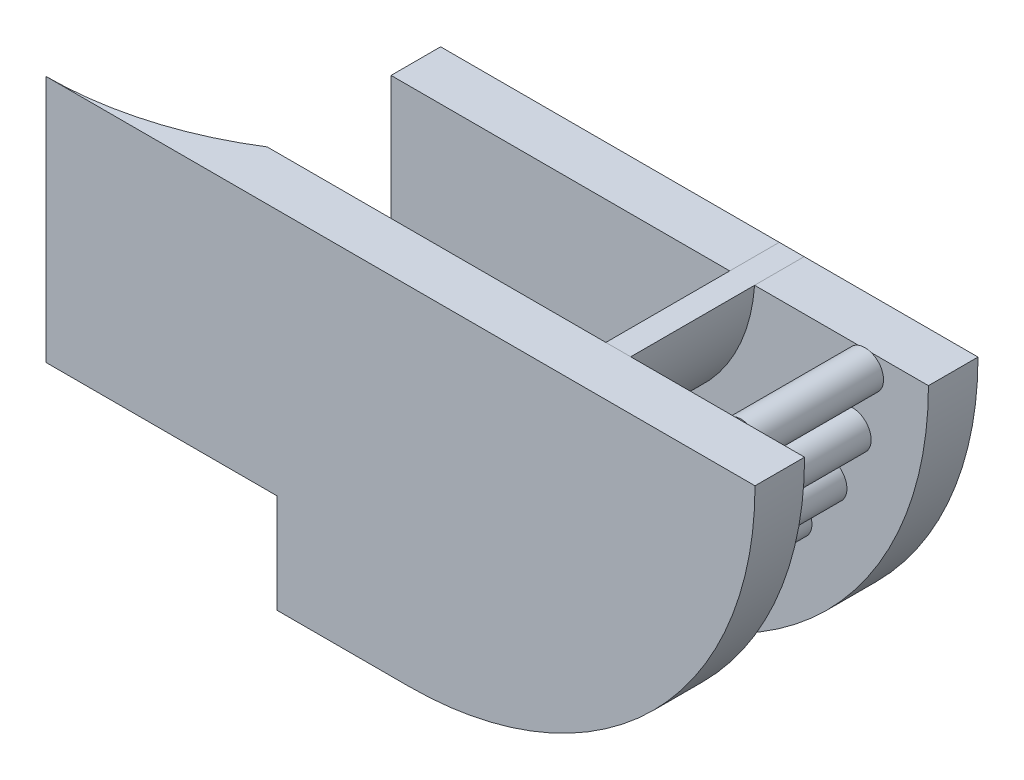
ISO-10303-21;
HEADER;
FILE_DESCRIPTION(('STEP AP214'),'2;1');
FILE_NAME('part.step','',(''),(''),'','','');
FILE_SCHEMA(('AUTOMOTIVE_DESIGN { 1 0 10303 214 1 1 1 1 }'));
ENDSEC;
DATA;
#1=APPLICATION_CONTEXT('core data for automotive mechanical design processes');
#2=APPLICATION_PROTOCOL_DEFINITION('international standard','automotive_design',2000,#1);
#3=PRODUCT_CONTEXT('',#1,'mechanical');
#4=PRODUCT('Part','Part','',(#3));
#5=PRODUCT_RELATED_PRODUCT_CATEGORY('part','',(#4));
#6=PRODUCT_DEFINITION_FORMATION('','',#4);
#7=PRODUCT_DEFINITION_CONTEXT('part definition',#1,'design');
#8=PRODUCT_DEFINITION('design','',#6,#7);
#9=PRODUCT_DEFINITION_SHAPE('','',#8);
#10=(LENGTH_UNIT() NAMED_UNIT(*) SI_UNIT(.MILLI.,.METRE.));
#11=(NAMED_UNIT(*) PLANE_ANGLE_UNIT() SI_UNIT($,.RADIAN.));
#12=(NAMED_UNIT(*) SI_UNIT($,.STERADIAN.) SOLID_ANGLE_UNIT());
#13=UNCERTAINTY_MEASURE_WITH_UNIT(LENGTH_MEASURE(1.E-05),#10,'distance_accuracy_value','');
#14=(GEOMETRIC_REPRESENTATION_CONTEXT(3) GLOBAL_UNCERTAINTY_ASSIGNED_CONTEXT((#13)) GLOBAL_UNIT_ASSIGNED_CONTEXT((#10,
#11,#12)) REPRESENTATION_CONTEXT('',''));
#15=CARTESIAN_POINT('',(0.,0.,0.));
#16=DIRECTION('',(0.,0.,1.));
#17=DIRECTION('',(1.,0.,0.));
#18=AXIS2_PLACEMENT_3D('',#15,#16,#17);
#19=CARTESIAN_POINT('',(0.,0.,0.));
#20=DIRECTION('',(0.,0.,1.));
#21=DIRECTION('',(1.,0.,0.));
#22=AXIS2_PLACEMENT_3D('',#19,#20,#21);
#23=PLANE('',#22);
#24=DIRECTION('',(1.,0.,0.));
#25=VECTOR('',#24,1.);
#26=CARTESIAN_POINT('',(0.,70.,0.));
#27=LINE('',#26,#25);
#28=CARTESIAN_POINT('',(44.8956518577535,70.,0.));
#29=VERTEX_POINT('',#28);
#30=CARTESIAN_POINT('',(49.9106001094224,70.,0.));
#31=VERTEX_POINT('',#30);
#32=EDGE_CURVE('E144',#29,#31,#27,.T.);
#33=ORIENTED_EDGE('',*,*,#32,.F.);
#34=CARTESIAN_POINT('',(15.,72.5,0.));
#35=DIRECTION('',(0.,0.,1.));
#36=DIRECTION('',(1.,0.,0.));
#37=AXIS2_PLACEMENT_3D('',#34,#35,#36);
#38=CIRCLE('',#37,30.);
#39=CARTESIAN_POINT('',(15.,42.5,0.));
#40=VERTEX_POINT('',#39);
#41=EDGE_CURVE('E148',#29,#40,#38,.F.);
#42=ORIENTED_EDGE('',*,*,#41,.T.);
#43=DIRECTION('',(1.,0.,0.));
#44=VECTOR('',#43,1.);
#45=CARTESIAN_POINT('',(0.,42.5,0.));
#46=LINE('',#45,#44);
#47=CARTESIAN_POINT('',(0.,42.5,0.));
#48=VERTEX_POINT('',#47);
#49=EDGE_CURVE('E150',#48,#40,#46,.T.);
#50=ORIENTED_EDGE('',*,*,#49,.F.);
#51=DIRECTION('',(0.,1.,0.));
#52=VECTOR('',#51,1.);
#53=CARTESIAN_POINT('',(0.,0.,0.));
#54=LINE('',#53,#52);
#55=CARTESIAN_POINT('',(0.,37.5,0.));
#56=VERTEX_POINT('',#55);
#57=EDGE_CURVE('E133',#56,#48,#54,.T.);
#58=ORIENTED_EDGE('',*,*,#57,.F.);
#59=DIRECTION('',(1.,0.,0.));
#60=VECTOR('',#59,1.);
#61=CARTESIAN_POINT('',(0.,37.5,0.));
#62=LINE('',#61,#60);
#63=CARTESIAN_POINT('',(15.,37.5,0.));
#64=VERTEX_POINT('',#63);
#65=EDGE_CURVE('E100',#56,#64,#62,.T.);
#66=ORIENTED_EDGE('',*,*,#65,.T.);
#67=CARTESIAN_POINT('',(15.,72.5,0.));
#68=DIRECTION('',(0.,0.,1.));
#69=DIRECTION('',(1.,0.,0.));
#70=AXIS2_PLACEMENT_3D('',#67,#68,#69);
#71=CIRCLE('',#70,35.);
#72=EDGE_CURVE('E105',#31,#64,#71,.F.);
#73=ORIENTED_EDGE('',*,*,#72,.F.);
#74=EDGE_LOOP('',(#33,#42,#50,#58,#66,#73));
#75=FACE_BOUND('',#74,.T.);
#76=ADVANCED_FACE('F62',(#75),#23,.T.);
#77=CARTESIAN_POINT('',(0.,0.,-35.));
#78=DIRECTION('',(0.,0.,-1.));
#79=DIRECTION('',(-1.,0.,0.));
#80=AXIS2_PLACEMENT_3D('',#77,#78,#79);
#81=PLANE('',#80);
#82=CARTESIAN_POINT('',(15.,72.5,-35.));
#83=DIRECTION('',(0.,0.,-1.));
#84=DIRECTION('',(-1.,0.,0.));
#85=AXIS2_PLACEMENT_3D('',#82,#83,#84);
#86=CIRCLE('',#85,30.);
#87=CARTESIAN_POINT('',(44.8956518577535,70.,-35.));
#88=VERTEX_POINT('',#87);
#89=CARTESIAN_POINT('',(15.,42.5,-35.));
#90=VERTEX_POINT('',#89);
#91=EDGE_CURVE('E13',#88,#90,#86,.T.);
#92=ORIENTED_EDGE('',*,*,#91,.F.);
#93=DIRECTION('',(1.,0.,0.));
#94=VECTOR('',#93,1.);
#95=CARTESIAN_POINT('',(0.,70.,-35.));
#96=LINE('',#95,#94);
#97=CARTESIAN_POINT('',(49.9106001094224,70.,-35.));
#98=VERTEX_POINT('',#97);
#99=EDGE_CURVE('E137',#88,#98,#96,.T.);
#100=ORIENTED_EDGE('',*,*,#99,.T.);
#101=CARTESIAN_POINT('',(15.,72.5,-35.));
#102=DIRECTION('',(0.,0.,-1.));
#103=DIRECTION('',(-1.,0.,0.));
#104=AXIS2_PLACEMENT_3D('',#101,#102,#103);
#105=CIRCLE('',#104,35.);
#106=CARTESIAN_POINT('',(15.,37.5,-35.));
#107=VERTEX_POINT('',#106);
#108=EDGE_CURVE('E121',#98,#107,#105,.T.);
#109=ORIENTED_EDGE('',*,*,#108,.T.);
#110=DIRECTION('',(1.,0.,0.));
#111=VECTOR('',#110,1.);
#112=CARTESIAN_POINT('',(0.,37.5,-35.));
#113=LINE('',#112,#111);
#114=CARTESIAN_POINT('',(0.,37.5,-35.));
#115=VERTEX_POINT('',#114);
#116=EDGE_CURVE('E127',#115,#107,#113,.T.);
#117=ORIENTED_EDGE('',*,*,#116,.F.);
#118=DIRECTION('',(0.,1.,0.));
#119=VECTOR('',#118,1.);
#120=CARTESIAN_POINT('',(0.,0.,-35.));
#121=LINE('',#120,#119);
#122=CARTESIAN_POINT('',(0.,42.5,-35.));
#123=VERTEX_POINT('',#122);
#124=EDGE_CURVE('E138',#115,#123,#121,.T.);
#125=ORIENTED_EDGE('',*,*,#124,.T.);
#126=DIRECTION('',(1.,0.,0.));
#127=VECTOR('',#126,1.);
#128=CARTESIAN_POINT('',(0.,42.5,-35.));
#129=LINE('',#128,#127);
#130=EDGE_CURVE('E140',#123,#90,#129,.T.);
#131=ORIENTED_EDGE('',*,*,#130,.T.);
#132=EDGE_LOOP('',(#92,#100,#109,#117,#125,#131));
#133=FACE_BOUND('',#132,.T.);
#134=ADVANCED_FACE('F135',(#133),#81,.T.);
#135=CARTESIAN_POINT('',(0.,70.,59.5593653700463));
#136=DIRECTION('',(0.,1.,0.));
#137=DIRECTION('',(-1.,0.,0.));
#138=AXIS2_PLACEMENT_3D('',#135,#136,#137);
#139=PLANE('',#138);
#140=DIRECTION('',(0.,0.,-1.));
#141=VECTOR('',#140,1.);
#142=CARTESIAN_POINT('',(44.8956518577535,70.,59.5593653700463));
#143=LINE('',#142,#141);
#144=EDGE_CURVE('E65',#29,#88,#143,.T.);
#145=ORIENTED_EDGE('',*,*,#144,.F.);
#146=ORIENTED_EDGE('',*,*,#32,.T.);
#147=DIRECTION('',(0.,0.,-1.));
#148=VECTOR('',#147,1.);
#149=CARTESIAN_POINT('',(49.9106001094224,70.,59.5593653700463));
#150=LINE('',#149,#148);
#151=EDGE_CURVE('E147',#31,#98,#150,.T.);
#152=ORIENTED_EDGE('',*,*,#151,.T.);
#153=ORIENTED_EDGE('',*,*,#99,.F.);
#154=EDGE_LOOP('',(#145,#146,#152,#153));
#155=FACE_BOUND('',#154,.T.);
#156=ADVANCED_FACE('F162',(#155),#139,.T.);
#157=CARTESIAN_POINT('',(15.,72.5,59.5593653700463));
#158=DIRECTION('',(0.,0.,-1.));
#159=DIRECTION('',(-1.,0.,0.));
#160=AXIS2_PLACEMENT_3D('',#157,#158,#159);
#161=CYLINDRICAL_SURFACE('',#160,35.);
#162=ORIENTED_EDGE('',*,*,#151,.F.);
#163=ORIENTED_EDGE('',*,*,#72,.T.);
#164=DIRECTION('',(0.,0.,-1.));
#165=VECTOR('',#164,1.);
#166=CARTESIAN_POINT('',(15.,37.5,59.5593653700463));
#167=LINE('',#166,#165);
#168=EDGE_CURVE('E117',#64,#107,#167,.T.);
#169=ORIENTED_EDGE('',*,*,#168,.T.);
#170=ORIENTED_EDGE('',*,*,#108,.F.);
#171=EDGE_LOOP('',(#162,#163,#169,#170));
#172=FACE_BOUND('',#171,.T.);
#173=ADVANCED_FACE('F119',(#172),#161,.T.);
#174=CARTESIAN_POINT('',(0.,37.5,59.5593653700463));
#175=DIRECTION('',(0.,1.,0.));
#176=DIRECTION('',(-1.,0.,0.));
#177=AXIS2_PLACEMENT_3D('',#174,#175,#176);
#178=PLANE('',#177);
#179=ORIENTED_EDGE('',*,*,#65,.F.);
#180=DIRECTION('',(0.,0.,-1.));
#181=VECTOR('',#180,1.);
#182=CARTESIAN_POINT('',(0.,37.5,59.5593653700463));
#183=LINE('',#182,#181);
#184=EDGE_CURVE('E124',#56,#115,#183,.T.);
#185=ORIENTED_EDGE('',*,*,#184,.T.);
#186=ORIENTED_EDGE('',*,*,#116,.T.);
#187=ORIENTED_EDGE('',*,*,#168,.F.);
#188=EDGE_LOOP('',(#179,#185,#186,#187));
#189=FACE_BOUND('',#188,.T.);
#190=ADVANCED_FACE('F128',(#189),#178,.F.);
#191=CARTESIAN_POINT('',(0.,0.,59.5593653700463));
#192=DIRECTION('',(-1.,0.,0.));
#193=DIRECTION('',(0.,-1.,0.));
#194=AXIS2_PLACEMENT_3D('',#191,#192,#193);
#195=PLANE('',#194);
#196=ORIENTED_EDGE('',*,*,#184,.F.);
#197=ORIENTED_EDGE('',*,*,#57,.T.);
#198=DIRECTION('',(0.,0.,-1.));
#199=VECTOR('',#198,1.);
#200=CARTESIAN_POINT('',(0.,42.5,59.5593653700463));
#201=LINE('',#200,#199);
#202=EDGE_CURVE('E154',#48,#123,#201,.T.);
#203=ORIENTED_EDGE('',*,*,#202,.T.);
#204=ORIENTED_EDGE('',*,*,#124,.F.);
#205=EDGE_LOOP('',(#196,#197,#203,#204));
#206=FACE_BOUND('',#205,.T.);
#207=ADVANCED_FACE('F171',(#206),#195,.T.);
#208=CARTESIAN_POINT('',(0.,42.5,59.5593653700463));
#209=DIRECTION('',(0.,1.,0.));
#210=DIRECTION('',(-1.,0.,0.));
#211=AXIS2_PLACEMENT_3D('',#208,#209,#210);
#212=PLANE('',#211);
#213=ORIENTED_EDGE('',*,*,#202,.F.);
#214=ORIENTED_EDGE('',*,*,#49,.T.);
#215=DIRECTION('',(0.,0.,-1.));
#216=VECTOR('',#215,1.);
#217=CARTESIAN_POINT('',(15.,42.5,59.5593653700463));
#218=LINE('',#217,#216);
#219=EDGE_CURVE('E153',#40,#90,#218,.T.);
#220=ORIENTED_EDGE('',*,*,#219,.T.);
#221=ORIENTED_EDGE('',*,*,#130,.F.);
#222=EDGE_LOOP('',(#213,#214,#220,#221));
#223=FACE_BOUND('',#222,.T.);
#224=ADVANCED_FACE('F169',(#223),#212,.T.);
#225=CARTESIAN_POINT('',(15.,72.5,59.5593653700463));
#226=DIRECTION('',(0.,0.,-1.));
#227=DIRECTION('',(-1.,0.,0.));
#228=AXIS2_PLACEMENT_3D('',#225,#226,#227);
#229=CYLINDRICAL_SURFACE('',#228,30.);
#230=ORIENTED_EDGE('',*,*,#41,.F.);
#231=ORIENTED_EDGE('',*,*,#144,.T.);
#232=ORIENTED_EDGE('',*,*,#91,.T.);
#233=ORIENTED_EDGE('',*,*,#219,.F.);
#234=EDGE_LOOP('',(#230,#231,#232,#233));
#235=FACE_BOUND('',#234,.T.);
#236=ADVANCED_FACE('F164',(#235),#229,.F.);
#237=CLOSED_SHELL('',(#76,#134,#156,#173,#190,#207,#224,#236));
#238=MANIFOLD_SOLID_BREP('B2',#237);
#239=CARTESIAN_POINT('',(0.,0.,10.));
#240=DIRECTION('',(0.,1.,0.));
#241=DIRECTION('',(0.,0.,1.));
#242=AXIS2_PLACEMENT_3D('',#239,#240,#241);
#243=PLANE('',#242);
#244=DIRECTION('',(1.,0.,0.));
#245=VECTOR('',#244,1.);
#246=CARTESIAN_POINT('',(0.,0.,0.));
#247=LINE('',#246,#245);
#248=CARTESIAN_POINT('',(0.,0.,0.));
#249=VERTEX_POINT('',#248);
#250=CARTESIAN_POINT('',(15.,0.,0.));
#251=VERTEX_POINT('',#250);
#252=EDGE_CURVE('E455',#249,#251,#247,.T.);
#253=ORIENTED_EDGE('',*,*,#252,.T.);
#254=DIRECTION('',(0.,0.,-1.));
#255=VECTOR('',#254,1.);
#256=CARTESIAN_POINT('',(15.,0.,10.));
#257=LINE('',#256,#255);
#258=CARTESIAN_POINT('',(15.,0.,10.));
#259=VERTEX_POINT('',#258);
#260=EDGE_CURVE('E473',#259,#251,#257,.T.);
#261=ORIENTED_EDGE('',*,*,#260,.F.);
#262=DIRECTION('',(1.,0.,0.));
#263=VECTOR('',#262,1.);
#264=CARTESIAN_POINT('',(0.,0.,10.));
#265=LINE('',#264,#263);
#266=CARTESIAN_POINT('',(-11.4578549276672,0.,9.99999999999999));
#267=VERTEX_POINT('',#266);
#268=EDGE_CURVE('E456',#267,#259,#265,.T.);
#269=ORIENTED_EDGE('',*,*,#268,.F.);
#270=CARTESIAN_POINT('',(-58.0947501931113,0.,-55.));
#271=DIRECTION('',(0.,1.,0.));
#272=DIRECTION('',(0.,0.,1.));
#273=AXIS2_PLACEMENT_3D('',#270,#271,#272);
#274=CIRCLE('',#273,80.);
#275=EDGE_CURVE('E450',#249,#267,#274,.F.);
#276=ORIENTED_EDGE('',*,*,#275,.F.);
#277=EDGE_LOOP('',(#253,#261,#269,#276));
#278=FACE_BOUND('',#277,.T.);
#279=ADVANCED_FACE('F257',(#278),#243,.F.);
#280=CARTESIAN_POINT('',(15.,70.,10.));
#281=DIRECTION('',(0.,0.,-1.));
#282=DIRECTION('',(-1.,0.,0.));
#283=AXIS2_PLACEMENT_3D('',#280,#281,#282);
#284=CYLINDRICAL_SURFACE('',#283,70.);
#285=CARTESIAN_POINT('',(15.,70.,0.));
#286=DIRECTION('',(0.,0.,1.));
#287=DIRECTION('',(1.,0.,0.));
#288=AXIS2_PLACEMENT_3D('',#285,#286,#287);
#289=CIRCLE('',#288,70.);
#290=CARTESIAN_POINT('',(85.,70.,0.));
#291=VERTEX_POINT('',#290);
#292=EDGE_CURVE('E467',#251,#291,#289,.T.);
#293=ORIENTED_EDGE('',*,*,#292,.T.);
#294=DIRECTION('',(0.,0.,-1.));
#295=VECTOR('',#294,1.);
#296=CARTESIAN_POINT('',(85.,70.,10.));
#297=LINE('',#296,#295);
#298=CARTESIAN_POINT('',(85.,70.,10.));
#299=VERTEX_POINT('',#298);
#300=EDGE_CURVE('E464',#299,#291,#297,.T.);
#301=ORIENTED_EDGE('',*,*,#300,.F.);
#302=CARTESIAN_POINT('',(15.,70.,10.));
#303=DIRECTION('',(0.,0.,1.));
#304=DIRECTION('',(1.,0.,0.));
#305=AXIS2_PLACEMENT_3D('',#302,#303,#304);
#306=CIRCLE('',#305,70.);
#307=EDGE_CURVE('E459',#259,#299,#306,.T.);
#308=ORIENTED_EDGE('',*,*,#307,.F.);
#309=ORIENTED_EDGE('',*,*,#260,.T.);
#310=EDGE_LOOP('',(#293,#301,#308,#309));
#311=FACE_BOUND('',#310,.T.);
#312=ADVANCED_FACE('F558',(#311),#284,.T.);
#313=CARTESIAN_POINT('',(0.,70.,10.));
#314=DIRECTION('',(0.,1.,0.));
#315=DIRECTION('',(0.,0.,1.));
#316=AXIS2_PLACEMENT_3D('',#313,#314,#315);
#317=PLANE('',#316);
#318=DIRECTION('',(1.,0.,0.));
#319=VECTOR('',#318,1.);
#320=CARTESIAN_POINT('',(0.,70.,0.));
#321=LINE('',#320,#319);
#322=CARTESIAN_POINT('',(-23.4537340417337,70.,0.));
#323=VERTEX_POINT('',#322);
#324=CARTESIAN_POINT('',(70.8660375463337,70.,0.));
#325=VERTEX_POINT('',#324);
#326=EDGE_CURVE('E355',#323,#325,#321,.T.);
#327=ORIENTED_EDGE('',*,*,#326,.F.);
#328=CARTESIAN_POINT('',(-58.0947501931113,70.,-55.));
#329=DIRECTION('',(0.,-1.,0.));
#330=DIRECTION('',(0.,0.,-1.));
#331=AXIS2_PLACEMENT_3D('',#328,#329,#330);
#332=CIRCLE('',#331,65.);
#333=CARTESIAN_POINT('',(-58.0947501931113,70.,10.));
#334=VERTEX_POINT('',#333);
#335=EDGE_CURVE('E438',#334,#323,#332,.F.);
#336=ORIENTED_EDGE('',*,*,#335,.F.);
#337=DIRECTION('',(1.,0.,0.));
#338=VECTOR('',#337,1.);
#339=CARTESIAN_POINT('',(0.,70.,10.));
#340=LINE('',#339,#338);
#341=EDGE_CURVE('E461',#334,#299,#340,.T.);
#342=ORIENTED_EDGE('',*,*,#341,.T.);
#343=ORIENTED_EDGE('',*,*,#300,.T.);
#344=CARTESIAN_POINT('',(73.5039804210178,70.,0.));
#345=VERTEX_POINT('',#344);
#346=EDGE_CURVE('E367',#345,#291,#321,.T.);
#347=ORIENTED_EDGE('',*,*,#346,.F.);
#348=EDGE_CURVE('E365',#325,#345,#321,.T.);
#349=ORIENTED_EDGE('',*,*,#348,.F.);
#350=EDGE_LOOP('',(#327,#336,#342,#343,#347,#349));
#351=FACE_BOUND('',#350,.T.);
#352=ADVANCED_FACE('F369',(#351),#317,.T.);
#353=CARTESIAN_POINT('',(0.,0.,10.));
#354=DIRECTION('',(0.,0.,1.));
#355=DIRECTION('',(1.,0.,0.));
#356=AXIS2_PLACEMENT_3D('',#353,#354,#355);
#357=PLANE('',#356);
#358=ORIENTED_EDGE('',*,*,#341,.F.);
#359=DIRECTION('',(0.,-1.,0.));
#360=VECTOR('',#359,1.);
#361=CARTESIAN_POINT('',(-58.0947501931113,70.,10.));
#362=LINE('',#361,#360);
#363=CARTESIAN_POINT('',(-58.0947501931113,20.,10.));
#364=VERTEX_POINT('',#363);
#365=EDGE_CURVE('E434',#364,#334,#362,.F.);
#366=ORIENTED_EDGE('',*,*,#365,.F.);
#367=DIRECTION('',(1.,0.,0.));
#368=VECTOR('',#367,1.);
#369=CARTESIAN_POINT('',(-123.095750193111,20.,10.));
#370=LINE('',#369,#368);
#371=CARTESIAN_POINT('',(-11.4578549276672,20.,9.99999999999999));
#372=VERTEX_POINT('',#371);
#373=EDGE_CURVE('E433',#364,#372,#370,.T.);
#374=ORIENTED_EDGE('',*,*,#373,.T.);
#375=DIRECTION('',(0.,1.,0.));
#376=VECTOR('',#375,1.);
#377=CARTESIAN_POINT('',(-11.4578549276672,0.,9.99999999999999));
#378=LINE('',#377,#376);
#379=EDGE_CURVE('E447',#267,#372,#378,.T.);
#380=ORIENTED_EDGE('',*,*,#379,.F.);
#381=ORIENTED_EDGE('',*,*,#268,.T.);
#382=ORIENTED_EDGE('',*,*,#307,.T.);
#383=EDGE_LOOP('',(#358,#366,#374,#380,#381,#382));
#384=FACE_BOUND('',#383,.T.);
#385=ADVANCED_FACE('F524',(#384),#357,.T.);
#386=CARTESIAN_POINT('',(0.,0.,0.));
#387=DIRECTION('',(0.,0.,1.));
#388=DIRECTION('',(1.,0.,0.));
#389=AXIS2_PLACEMENT_3D('',#386,#387,#388);
#390=PLANE('',#389);
#391=CARTESIAN_POINT('',(72.1850089836757,66.4896133621101,0.));
#392=DIRECTION('',(0.,0.,-1.));
#393=DIRECTION('',(-1.,0.,0.));
#394=AXIS2_PLACEMENT_3D('',#391,#392,#393);
#395=CIRCLE('',#394,3.75000000000001);
#396=EDGE_CURVE('E271',#345,#325,#395,.T.);
#397=ORIENTED_EDGE('',*,*,#396,.F.);
#398=ORIENTED_EDGE('',*,*,#346,.T.);
#399=ORIENTED_EDGE('',*,*,#292,.F.);
#400=ORIENTED_EDGE('',*,*,#252,.F.);
#401=DIRECTION('',(0.,1.,0.));
#402=VECTOR('',#401,1.);
#403=CARTESIAN_POINT('',(0.,0.,0.));
#404=LINE('',#403,#402);
#405=CARTESIAN_POINT('',(0.,20.,0.));
#406=VERTEX_POINT('',#405);
#407=EDGE_CURVE('E364',#249,#406,#404,.T.);
#408=ORIENTED_EDGE('',*,*,#407,.T.);
#409=DIRECTION('',(1.,0.,0.));
#410=VECTOR('',#409,1.);
#411=CARTESIAN_POINT('',(-123.095750193111,20.,0.));
#412=LINE('',#411,#410);
#413=CARTESIAN_POINT('',(-23.4537340417337,20.,0.));
#414=VERTEX_POINT('',#413);
#415=EDGE_CURVE('E443',#414,#406,#412,.T.);
#416=ORIENTED_EDGE('',*,*,#415,.F.);
#417=DIRECTION('',(0.,-1.,0.));
#418=VECTOR('',#417,1.);
#419=CARTESIAN_POINT('',(-23.4537340417337,70.,0.));
#420=LINE('',#419,#418);
#421=EDGE_CURVE('E360',#323,#414,#420,.T.);
#422=ORIENTED_EDGE('',*,*,#421,.F.);
#423=ORIENTED_EDGE('',*,*,#326,.T.);
#424=EDGE_LOOP('',(#397,#398,#399,#400,#408,#416,#422,#423));
#425=FACE_BOUND('',#424,.T.);
#426=CARTESIAN_POINT('',(69.6857496869714,54.7315228234407,0.));
#427=DIRECTION('',(0.,0.,1.));
#428=DIRECTION('',(1.,0.,0.));
#429=AXIS2_PLACEMENT_3D('',#426,#427,#428);
#430=CIRCLE('',#429,3.75);
#431=CARTESIAN_POINT('',(73.4357496869714,54.7315228234407,0.));
#432=VERTEX_POINT('',#431);
#433=EDGE_CURVE('E264',#432,#432,#430,.F.);
#434=ORIENTED_EDGE('',*,*,#433,.F.);
#435=EDGE_LOOP('',(#434));
#436=FACE_BOUND('',#435,.T.);
#437=CARTESIAN_POINT('',(64.7964607176053,43.7500000000001,0.));
#438=DIRECTION('',(0.,0.,1.));
#439=DIRECTION('',(1.,0.,0.));
#440=AXIS2_PLACEMENT_3D('',#437,#438,#439);
#441=CIRCLE('',#440,3.75);
#442=CARTESIAN_POINT('',(68.5464607176053,43.7500000000001,0.));
#443=VERTEX_POINT('',#442);
#444=EDGE_CURVE('E512',#443,#443,#441,.F.);
#445=ORIENTED_EDGE('',*,*,#444,.F.);
#446=EDGE_LOOP('',(#445));
#447=FACE_BOUND('',#446,.T.);
#448=CARTESIAN_POINT('',(57.7308274649502,34.0249901343657,0.));
#449=DIRECTION('',(0.,0.,1.));
#450=DIRECTION('',(1.,0.,0.));
#451=AXIS2_PLACEMENT_3D('',#448,#449,#450);
#452=CIRCLE('',#451,3.75);
#453=CARTESIAN_POINT('',(61.4808274649502,34.0249901343657,0.));
#454=VERTEX_POINT('',#453);
#455=EDGE_CURVE('E506',#454,#454,#452,.F.);
#456=ORIENTED_EDGE('',*,*,#455,.F.);
#457=EDGE_LOOP('',(#456));
#458=FACE_BOUND('',#457,.T.);
#459=CARTESIAN_POINT('',(48.7976520068173,25.9815228234406,0.));
#460=DIRECTION('',(0.,0.,1.));
#461=DIRECTION('',(1.,0.,0.));
#462=AXIS2_PLACEMENT_3D('',#459,#460,#461);
#463=CIRCLE('',#462,3.75);
#464=CARTESIAN_POINT('',(52.5476520068173,25.9815228234406,0.));
#465=VERTEX_POINT('',#464);
#466=EDGE_CURVE('E500',#465,#465,#463,.F.);
#467=ORIENTED_EDGE('',*,*,#466,.F.);
#468=EDGE_LOOP('',(#467));
#469=FACE_BOUND('',#468,.T.);
#470=CARTESIAN_POINT('',(38.3873569768586,19.9711361855505,0.));
#471=DIRECTION('',(0.,0.,1.));
#472=DIRECTION('',(1.,0.,0.));
#473=AXIS2_PLACEMENT_3D('',#470,#471,#472);
#474=CIRCLE('',#473,3.75000000000001);
#475=CARTESIAN_POINT('',(42.1373569768586,19.9711361855505,0.));
#476=VERTEX_POINT('',#475);
#477=EDGE_CURVE('E494',#476,#476,#474,.F.);
#478=ORIENTED_EDGE('',*,*,#477,.F.);
#479=EDGE_LOOP('',(#478));
#480=FACE_BOUND('',#479,.T.);
#481=CARTESIAN_POINT('',(26.9549222220212,16.2565129578062,0.));
#482=DIRECTION('',(0.,0.,1.));
#483=DIRECTION('',(1.,0.,0.));
#484=AXIS2_PLACEMENT_3D('',#481,#482,#483);
#485=CIRCLE('',#484,3.75);
#486=CARTESIAN_POINT('',(30.7049222220212,16.2565129578062,0.));
#487=VERTEX_POINT('',#486);
#488=EDGE_CURVE('E488',#487,#487,#485,.F.);
#489=ORIENTED_EDGE('',*,*,#488,.F.);
#490=EDGE_LOOP('',(#489));
#491=FACE_BOUND('',#490,.T.);
#492=CARTESIAN_POINT('',(15.,15.,0.));
#493=DIRECTION('',(0.,0.,1.));
#494=DIRECTION('',(1.,0.,0.));
#495=AXIS2_PLACEMENT_3D('',#492,#493,#494);
#496=CIRCLE('',#495,3.75);
#497=CARTESIAN_POINT('',(18.75,15.,0.));
#498=VERTEX_POINT('',#497);
#499=EDGE_CURVE('E482',#498,#498,#496,.F.);
#500=ORIENTED_EDGE('',*,*,#499,.F.);
#501=EDGE_LOOP('',(#500));
#502=FACE_BOUND('',#501,.T.);
#503=CARTESIAN_POINT('',(3.95746955074761,15.,0.));
#504=DIRECTION('',(0.,0.,1.));
#505=DIRECTION('',(1.,0.,0.));
#506=AXIS2_PLACEMENT_3D('',#503,#504,#505);
#507=CIRCLE('',#506,3.75);
#508=CARTESIAN_POINT('',(7.70746955074761,15.,0.));
#509=VERTEX_POINT('',#508);
#510=EDGE_CURVE('E476',#509,#509,#507,.F.);
#511=ORIENTED_EDGE('',*,*,#510,.F.);
#512=EDGE_LOOP('',(#511));
#513=FACE_BOUND('',#512,.T.);
#514=ADVANCED_FACE('F357',(#425,#436,#447,#458,#469,#480,#491,#502,#513),#390,.F.);
#515=CARTESIAN_POINT('',(-58.0947501931113,0.,-55.));
#516=DIRECTION('',(0.,1.,0.));
#517=DIRECTION('',(-1.,0.,0.));
#518=AXIS2_PLACEMENT_3D('',#515,#516,#517);
#519=CYLINDRICAL_SURFACE('',#518,80.);
#520=ORIENTED_EDGE('',*,*,#379,.T.);
#521=CARTESIAN_POINT('',(-58.0947501931113,20.,-55.));
#522=DIRECTION('',(0.,-1.,0.));
#523=DIRECTION('',(0.,0.,-1.));
#524=AXIS2_PLACEMENT_3D('',#521,#522,#523);
#525=CIRCLE('',#524,80.);
#526=EDGE_CURVE('E437',#372,#406,#525,.F.);
#527=ORIENTED_EDGE('',*,*,#526,.T.);
#528=ORIENTED_EDGE('',*,*,#407,.F.);
#529=ORIENTED_EDGE('',*,*,#275,.T.);
#530=EDGE_LOOP('',(#520,#527,#528,#529));
#531=FACE_BOUND('',#530,.T.);
#532=ADVANCED_FACE('F523',(#531),#519,.F.);
#533=CARTESIAN_POINT('',(-123.095750193111,20.,0.));
#534=DIRECTION('',(0.,1.,0.));
#535=DIRECTION('',(0.,0.,1.));
#536=AXIS2_PLACEMENT_3D('',#533,#534,#535);
#537=PLANE('',#536);
#538=ORIENTED_EDGE('',*,*,#526,.F.);
#539=ORIENTED_EDGE('',*,*,#373,.F.);
#540=CARTESIAN_POINT('',(-58.0947501931113,20.,-55.));
#541=DIRECTION('',(0.,1.,0.));
#542=DIRECTION('',(0.,0.,1.));
#543=AXIS2_PLACEMENT_3D('',#540,#541,#542);
#544=CIRCLE('',#543,65.);
#545=EDGE_CURVE('E440',#414,#364,#544,.F.);
#546=ORIENTED_EDGE('',*,*,#545,.F.);
#547=ORIENTED_EDGE('',*,*,#415,.T.);
#548=EDGE_LOOP('',(#538,#539,#546,#547));
#549=FACE_BOUND('',#548,.T.);
#550=ADVANCED_FACE('F553',(#549),#537,.F.);
#551=CARTESIAN_POINT('',(-58.0947501931113,70.,-55.));
#552=DIRECTION('',(0.,-1.,0.));
#553=DIRECTION('',(1.,0.,0.));
#554=AXIS2_PLACEMENT_3D('',#551,#552,#553);
#555=CYLINDRICAL_SURFACE('',#554,65.);
#556=ORIENTED_EDGE('',*,*,#335,.T.);
#557=ORIENTED_EDGE('',*,*,#421,.T.);
#558=ORIENTED_EDGE('',*,*,#545,.T.);
#559=ORIENTED_EDGE('',*,*,#365,.T.);
#560=EDGE_LOOP('',(#556,#557,#558,#559));
#561=FACE_BOUND('',#560,.T.);
#562=ADVANCED_FACE('F543',(#561),#555,.F.);
#563=CARTESIAN_POINT('',(3.95746955074761,15.,-25.));
#564=DIRECTION('',(0.,0.,1.));
#565=DIRECTION('',(1.,0.,0.));
#566=AXIS2_PLACEMENT_3D('',#563,#564,#565);
#567=CYLINDRICAL_SURFACE('',#566,3.75);
#568=CARTESIAN_POINT('',(3.95746955074761,15.,-25.));
#569=DIRECTION('',(0.,0.,-1.));
#570=DIRECTION('',(-1.,0.,0.));
#571=AXIS2_PLACEMENT_3D('',#568,#569,#570);
#572=CIRCLE('',#571,3.75);
#573=CARTESIAN_POINT('',(0.207469550747605,15.,-25.));
#574=VERTEX_POINT('',#573);
#575=EDGE_CURVE('E430',#574,#574,#572,.T.);
#576=ORIENTED_EDGE('',*,*,#575,.F.);
#577=EDGE_LOOP('',(#576));
#578=FACE_BOUND('',#577,.T.);
#579=ORIENTED_EDGE('',*,*,#510,.T.);
#580=EDGE_LOOP('',(#579));
#581=FACE_BOUND('',#580,.T.);
#582=ADVANCED_FACE('F540',(#578,#581),#567,.T.);
#583=CARTESIAN_POINT('',(15.,70.,-35.));
#584=DIRECTION('',(0.,0.,1.));
#585=DIRECTION('',(1.,0.,0.));
#586=AXIS2_PLACEMENT_3D('',#583,#584,#585);
#587=CYLINDRICAL_SURFACE('',#586,70.);
#588=CARTESIAN_POINT('',(15.,70.,-25.));
#589=DIRECTION('',(0.,0.,-1.));
#590=DIRECTION('',(-1.,0.,0.));
#591=AXIS2_PLACEMENT_3D('',#588,#589,#590);
#592=CIRCLE('',#591,70.);
#593=CARTESIAN_POINT('',(85.,70.,-25.));
#594=VERTEX_POINT('',#593);
#595=CARTESIAN_POINT('',(15.,0.,-25.));
#596=VERTEX_POINT('',#595);
#597=EDGE_CURVE('E381',#594,#596,#592,.T.);
#598=ORIENTED_EDGE('',*,*,#597,.T.);
#599=DIRECTION('',(0.,0.,1.));
#600=VECTOR('',#599,1.);
#601=CARTESIAN_POINT('',(15.,0.,-35.));
#602=LINE('',#601,#600);
#603=CARTESIAN_POINT('',(15.,0.,-35.));
#604=VERTEX_POINT('',#603);
#605=EDGE_CURVE('E427',#604,#596,#602,.T.);
#606=ORIENTED_EDGE('',*,*,#605,.F.);
#607=CARTESIAN_POINT('',(15.,70.,-35.));
#608=DIRECTION('',(0.,0.,-1.));
#609=DIRECTION('',(-1.,0.,0.));
#610=AXIS2_PLACEMENT_3D('',#607,#608,#609);
#611=CIRCLE('',#610,70.);
#612=CARTESIAN_POINT('',(85.,70.,-35.));
#613=VERTEX_POINT('',#612);
#614=EDGE_CURVE('E388',#613,#604,#611,.T.);
#615=ORIENTED_EDGE('',*,*,#614,.F.);
#616=DIRECTION('',(0.,0.,1.));
#617=VECTOR('',#616,1.);
#618=CARTESIAN_POINT('',(85.,70.,-35.));
#619=LINE('',#618,#617);
#620=EDGE_CURVE('E401',#613,#594,#619,.T.);
#621=ORIENTED_EDGE('',*,*,#620,.T.);
#622=EDGE_LOOP('',(#598,#606,#615,#621));
#623=FACE_BOUND('',#622,.T.);
#624=ADVANCED_FACE('F542',(#623),#587,.T.);
#625=CARTESIAN_POINT('',(15.,0.,-35.));
#626=DIRECTION('',(0.,1.,0.));
#627=DIRECTION('',(0.,0.,1.));
#628=AXIS2_PLACEMENT_3D('',#625,#626,#627);
#629=PLANE('',#628);
#630=DIRECTION('',(-1.,0.,0.));
#631=VECTOR('',#630,1.);
#632=CARTESIAN_POINT('',(15.,0.,-25.));
#633=LINE('',#632,#631);
#634=CARTESIAN_POINT('',(0.,0.,-25.));
#635=VERTEX_POINT('',#634);
#636=EDGE_CURVE('E383',#596,#635,#633,.T.);
#637=ORIENTED_EDGE('',*,*,#636,.T.);
#638=DIRECTION('',(0.,0.,1.));
#639=VECTOR('',#638,1.);
#640=CARTESIAN_POINT('',(0.,0.,-35.));
#641=LINE('',#640,#639);
#642=CARTESIAN_POINT('',(0.,0.,-35.));
#643=VERTEX_POINT('',#642);
#644=EDGE_CURVE('E424',#643,#635,#641,.T.);
#645=ORIENTED_EDGE('',*,*,#644,.F.);
#646=DIRECTION('',(-1.,0.,0.));
#647=VECTOR('',#646,1.);
#648=CARTESIAN_POINT('',(15.,0.,-35.));
#649=LINE('',#648,#647);
#650=EDGE_CURVE('E391',#604,#643,#649,.T.);
#651=ORIENTED_EDGE('',*,*,#650,.F.);
#652=ORIENTED_EDGE('',*,*,#605,.T.);
#653=EDGE_LOOP('',(#637,#645,#651,#652));
#654=FACE_BOUND('',#653,.T.);
#655=ADVANCED_FACE('F550',(#654),#629,.F.);
#656=CARTESIAN_POINT('',(0.,0.,-35.));
#657=DIRECTION('',(1.,0.,0.));
#658=DIRECTION('',(0.,0.,-1.));
#659=AXIS2_PLACEMENT_3D('',#656,#657,#658);
#660=PLANE('',#659);
#661=DIRECTION('',(0.,1.,0.));
#662=VECTOR('',#661,1.);
#663=CARTESIAN_POINT('',(0.,0.,-25.));
#664=LINE('',#663,#662);
#665=CARTESIAN_POINT('',(0.,20.,-25.));
#666=VERTEX_POINT('',#665);
#667=EDGE_CURVE('E404',#635,#666,#664,.T.);
#668=ORIENTED_EDGE('',*,*,#667,.T.);
#669=DIRECTION('',(0.,0.,1.));
#670=VECTOR('',#669,1.);
#671=CARTESIAN_POINT('',(0.,20.,-35.));
#672=LINE('',#671,#670);
#673=CARTESIAN_POINT('',(0.,20.,-35.));
#674=VERTEX_POINT('',#673);
#675=EDGE_CURVE('E421',#674,#666,#672,.T.);
#676=ORIENTED_EDGE('',*,*,#675,.F.);
#677=DIRECTION('',(0.,1.,0.));
#678=VECTOR('',#677,1.);
#679=CARTESIAN_POINT('',(0.,0.,-35.));
#680=LINE('',#679,#678);
#681=EDGE_CURVE('E394',#643,#674,#680,.T.);
#682=ORIENTED_EDGE('',*,*,#681,.F.);
#683=ORIENTED_EDGE('',*,*,#644,.T.);
#684=EDGE_LOOP('',(#668,#676,#682,#683));
#685=FACE_BOUND('',#684,.T.);
#686=ADVANCED_FACE('F633',(#685),#660,.F.);
#687=CARTESIAN_POINT('',(0.,20.,-35.));
#688=DIRECTION('',(0.,1.,0.));
#689=DIRECTION('',(-1.,0.,0.));
#690=AXIS2_PLACEMENT_3D('',#687,#688,#689);
#691=PLANE('',#690);
#692=DIRECTION('',(-1.,0.,0.));
#693=VECTOR('',#692,1.);
#694=CARTESIAN_POINT('',(0.,20.,-25.));
#695=LINE('',#694,#693);
#696=CARTESIAN_POINT('',(-23.4537340417337,20.,-25.));
#697=VERTEX_POINT('',#696);
#698=EDGE_CURVE('E406',#666,#697,#695,.T.);
#699=ORIENTED_EDGE('',*,*,#698,.T.);
#700=DIRECTION('',(0.,0.,1.));
#701=VECTOR('',#700,1.);
#702=CARTESIAN_POINT('',(-23.4537340417337,20.,-35.));
#703=LINE('',#702,#701);
#704=CARTESIAN_POINT('',(-23.4537340417337,20.,-35.));
#705=VERTEX_POINT('',#704);
#706=EDGE_CURVE('E418',#705,#697,#703,.T.);
#707=ORIENTED_EDGE('',*,*,#706,.F.);
#708=DIRECTION('',(-1.,0.,0.));
#709=VECTOR('',#708,1.);
#710=CARTESIAN_POINT('',(0.,20.,-35.));
#711=LINE('',#710,#709);
#712=EDGE_CURVE('E396',#674,#705,#711,.T.);
#713=ORIENTED_EDGE('',*,*,#712,.F.);
#714=ORIENTED_EDGE('',*,*,#675,.T.);
#715=EDGE_LOOP('',(#699,#707,#713,#714));
#716=FACE_BOUND('',#715,.T.);
#717=ADVANCED_FACE('F643',(#716),#691,.F.);
#718=CARTESIAN_POINT('',(-23.4537340417337,20.,-35.));
#719=DIRECTION('',(1.,0.,0.));
#720=DIRECTION('',(0.,1.,0.));
#721=AXIS2_PLACEMENT_3D('',#718,#719,#720);
#722=PLANE('',#721);
#723=DIRECTION('',(0.,1.,0.));
#724=VECTOR('',#723,1.);
#725=CARTESIAN_POINT('',(-23.4537340417337,20.,-25.));
#726=LINE('',#725,#724);
#727=CARTESIAN_POINT('',(-23.4537340417337,70.,-25.));
#728=VERTEX_POINT('',#727);
#729=EDGE_CURVE('E408',#697,#728,#726,.T.);
#730=ORIENTED_EDGE('',*,*,#729,.T.);
#731=DIRECTION('',(0.,0.,1.));
#732=VECTOR('',#731,1.);
#733=CARTESIAN_POINT('',(-23.4537340417337,70.,-35.));
#734=LINE('',#733,#732);
#735=CARTESIAN_POINT('',(-23.4537340417337,70.,-35.));
#736=VERTEX_POINT('',#735);
#737=EDGE_CURVE('E415',#736,#728,#734,.T.);
#738=ORIENTED_EDGE('',*,*,#737,.F.);
#739=DIRECTION('',(0.,1.,0.));
#740=VECTOR('',#739,1.);
#741=CARTESIAN_POINT('',(-23.4537340417337,20.,-35.));
#742=LINE('',#741,#740);
#743=EDGE_CURVE('E398',#705,#736,#742,.T.);
#744=ORIENTED_EDGE('',*,*,#743,.F.);
#745=ORIENTED_EDGE('',*,*,#706,.T.);
#746=EDGE_LOOP('',(#730,#738,#744,#745));
#747=FACE_BOUND('',#746,.T.);
#748=ADVANCED_FACE('F653',(#747),#722,.F.);
#749=CARTESIAN_POINT('',(-23.4537340417337,70.,-35.));
#750=DIRECTION('',(0.,-1.,0.));
#751=DIRECTION('',(1.,0.,0.));
#752=AXIS2_PLACEMENT_3D('',#749,#750,#751);
#753=PLANE('',#752);
#754=DIRECTION('',(1.,0.,0.));
#755=VECTOR('',#754,1.);
#756=CARTESIAN_POINT('',(-23.4537340417337,70.,-25.));
#757=LINE('',#756,#755);
#758=CARTESIAN_POINT('',(70.8660375463337,70.,-25.));
#759=VERTEX_POINT('',#758);
#760=EDGE_CURVE('E392',#728,#759,#757,.T.);
#761=ORIENTED_EDGE('',*,*,#760,.T.);
#762=CARTESIAN_POINT('',(73.5039804210178,70.,-25.));
#763=VERTEX_POINT('',#762);
#764=EDGE_CURVE('E412',#759,#763,#757,.T.);
#765=ORIENTED_EDGE('',*,*,#764,.T.);
#766=EDGE_CURVE('E410',#763,#594,#757,.T.);
#767=ORIENTED_EDGE('',*,*,#766,.T.);
#768=ORIENTED_EDGE('',*,*,#620,.F.);
#769=DIRECTION('',(1.,0.,0.));
#770=VECTOR('',#769,1.);
#771=CARTESIAN_POINT('',(-23.4537340417337,70.,-35.));
#772=LINE('',#771,#770);
#773=EDGE_CURVE('E400',#736,#613,#772,.T.);
#774=ORIENTED_EDGE('',*,*,#773,.F.);
#775=ORIENTED_EDGE('',*,*,#737,.T.);
#776=EDGE_LOOP('',(#761,#765,#767,#768,#774,#775));
#777=FACE_BOUND('',#776,.T.);
#778=ADVANCED_FACE('F663',(#777),#753,.F.);
#779=CARTESIAN_POINT('',(15.,70.,-35.));
#780=DIRECTION('',(0.,0.,-1.));
#781=DIRECTION('',(-1.,0.,0.));
#782=AXIS2_PLACEMENT_3D('',#779,#780,#781);
#783=PLANE('',#782);
#784=ORIENTED_EDGE('',*,*,#614,.T.);
#785=ORIENTED_EDGE('',*,*,#650,.T.);
#786=ORIENTED_EDGE('',*,*,#681,.T.);
#787=ORIENTED_EDGE('',*,*,#712,.T.);
#788=ORIENTED_EDGE('',*,*,#743,.T.);
#789=ORIENTED_EDGE('',*,*,#773,.T.);
#790=EDGE_LOOP('',(#784,#785,#786,#787,#788,#789));
#791=FACE_BOUND('',#790,.T.);
#792=ADVANCED_FACE('F673',(#791),#783,.T.);
#793=CARTESIAN_POINT('',(15.,70.,-25.));
#794=DIRECTION('',(0.,0.,-1.));
#795=DIRECTION('',(-1.,0.,0.));
#796=AXIS2_PLACEMENT_3D('',#793,#794,#795);
#797=PLANE('',#796);
#798=CARTESIAN_POINT('',(72.1850089836757,66.4896133621101,-25.));
#799=DIRECTION('',(0.,0.,-1.));
#800=DIRECTION('',(-1.,0.,0.));
#801=AXIS2_PLACEMENT_3D('',#798,#799,#800);
#802=CIRCLE('',#801,3.75000000000001);
#803=EDGE_CURVE('E60',#759,#763,#802,.F.);
#804=ORIENTED_EDGE('',*,*,#803,.F.);
#805=ORIENTED_EDGE('',*,*,#760,.F.);
#806=ORIENTED_EDGE('',*,*,#729,.F.);
#807=ORIENTED_EDGE('',*,*,#698,.F.);
#808=ORIENTED_EDGE('',*,*,#667,.F.);
#809=ORIENTED_EDGE('',*,*,#636,.F.);
#810=ORIENTED_EDGE('',*,*,#597,.F.);
#811=ORIENTED_EDGE('',*,*,#766,.F.);
#812=EDGE_LOOP('',(#804,#805,#806,#807,#808,#809,#810,#811));
#813=FACE_BOUND('',#812,.T.);
#814=CARTESIAN_POINT('',(69.6857496869714,54.7315228234407,-25.));
#815=DIRECTION('',(0.,0.,-1.));
#816=DIRECTION('',(-1.,0.,0.));
#817=AXIS2_PLACEMENT_3D('',#814,#815,#816);
#818=CIRCLE('',#817,3.75);
#819=CARTESIAN_POINT('',(65.9357496869714,54.7315228234407,-25.));
#820=VERTEX_POINT('',#819);
#821=EDGE_CURVE('E515',#820,#820,#818,.F.);
#822=ORIENTED_EDGE('',*,*,#821,.F.);
#823=EDGE_LOOP('',(#822));
#824=FACE_BOUND('',#823,.T.);
#825=CARTESIAN_POINT('',(64.7964607176053,43.7500000000001,-25.));
#826=DIRECTION('',(0.,0.,-1.));
#827=DIRECTION('',(-1.,0.,0.));
#828=AXIS2_PLACEMENT_3D('',#825,#826,#827);
#829=CIRCLE('',#828,3.75);
#830=CARTESIAN_POINT('',(61.0464607176053,43.7500000000001,-25.));
#831=VERTEX_POINT('',#830);
#832=EDGE_CURVE('E509',#831,#831,#829,.F.);
#833=ORIENTED_EDGE('',*,*,#832,.F.);
#834=EDGE_LOOP('',(#833));
#835=FACE_BOUND('',#834,.T.);
#836=CARTESIAN_POINT('',(57.7308274649502,34.0249901343657,-25.));
#837=DIRECTION('',(0.,0.,-1.));
#838=DIRECTION('',(-1.,0.,0.));
#839=AXIS2_PLACEMENT_3D('',#836,#837,#838);
#840=CIRCLE('',#839,3.75);
#841=CARTESIAN_POINT('',(53.9808274649502,34.0249901343657,-25.));
#842=VERTEX_POINT('',#841);
#843=EDGE_CURVE('E503',#842,#842,#840,.F.);
#844=ORIENTED_EDGE('',*,*,#843,.F.);
#845=EDGE_LOOP('',(#844));
#846=FACE_BOUND('',#845,.T.);
#847=CARTESIAN_POINT('',(48.7976520068173,25.9815228234406,-25.));
#848=DIRECTION('',(0.,0.,-1.));
#849=DIRECTION('',(-1.,0.,0.));
#850=AXIS2_PLACEMENT_3D('',#847,#848,#849);
#851=CIRCLE('',#850,3.75);
#852=CARTESIAN_POINT('',(45.0476520068173,25.9815228234406,-25.));
#853=VERTEX_POINT('',#852);
#854=EDGE_CURVE('E497',#853,#853,#851,.F.);
#855=ORIENTED_EDGE('',*,*,#854,.F.);
#856=EDGE_LOOP('',(#855));
#857=FACE_BOUND('',#856,.T.);
#858=CARTESIAN_POINT('',(38.3873569768586,19.9711361855505,-25.));
#859=DIRECTION('',(0.,0.,-1.));
#860=DIRECTION('',(-1.,0.,0.));
#861=AXIS2_PLACEMENT_3D('',#858,#859,#860);
#862=CIRCLE('',#861,3.75000000000001);
#863=CARTESIAN_POINT('',(34.6373569768586,19.9711361855505,-25.));
#864=VERTEX_POINT('',#863);
#865=EDGE_CURVE('E491',#864,#864,#862,.F.);
#866=ORIENTED_EDGE('',*,*,#865,.F.);
#867=EDGE_LOOP('',(#866));
#868=FACE_BOUND('',#867,.T.);
#869=CARTESIAN_POINT('',(26.9549222220212,16.2565129578062,-25.));
#870=DIRECTION('',(0.,0.,-1.));
#871=DIRECTION('',(-1.,0.,0.));
#872=AXIS2_PLACEMENT_3D('',#869,#870,#871);
#873=CIRCLE('',#872,3.75);
#874=CARTESIAN_POINT('',(23.2049222220212,16.2565129578062,-25.));
#875=VERTEX_POINT('',#874);
#876=EDGE_CURVE('E485',#875,#875,#873,.F.);
#877=ORIENTED_EDGE('',*,*,#876,.F.);
#878=EDGE_LOOP('',(#877));
#879=FACE_BOUND('',#878,.T.);
#880=CARTESIAN_POINT('',(15.,15.,-25.));
#881=DIRECTION('',(0.,0.,-1.));
#882=DIRECTION('',(-1.,0.,0.));
#883=AXIS2_PLACEMENT_3D('',#880,#881,#882);
#884=CIRCLE('',#883,3.75);
#885=CARTESIAN_POINT('',(11.25,15.,-25.));
#886=VERTEX_POINT('',#885);
#887=EDGE_CURVE('E479',#886,#886,#884,.F.);
#888=ORIENTED_EDGE('',*,*,#887,.F.);
#889=EDGE_LOOP('',(#888));
#890=FACE_BOUND('',#889,.T.);
#891=ORIENTED_EDGE('',*,*,#575,.T.);
#892=EDGE_LOOP('',(#891));
#893=FACE_BOUND('',#892,.T.);
#894=ADVANCED_FACE('F683',(#813,#824,#835,#846,#857,#868,#879,#890,#893),#797,.F.);
#895=CARTESIAN_POINT('',(15.,15.,-25.));
#896=DIRECTION('',(0.,0.,1.));
#897=DIRECTION('',(1.,0.,0.));
#898=AXIS2_PLACEMENT_3D('',#895,#896,#897);
#899=CYLINDRICAL_SURFACE('',#898,3.75);
#900=ORIENTED_EDGE('',*,*,#887,.T.);
#901=EDGE_LOOP('',(#900));
#902=FACE_BOUND('',#901,.T.);
#903=ORIENTED_EDGE('',*,*,#499,.T.);
#904=EDGE_LOOP('',(#903));
#905=FACE_BOUND('',#904,.T.);
#906=ADVANCED_FACE('F693',(#902,#905),#899,.T.);
#907=CARTESIAN_POINT('',(26.9549222220212,16.2565129578062,-25.));
#908=DIRECTION('',(0.,0.,1.));
#909=DIRECTION('',(1.,0.,0.));
#910=AXIS2_PLACEMENT_3D('',#907,#908,#909);
#911=CYLINDRICAL_SURFACE('',#910,3.75);
#912=ORIENTED_EDGE('',*,*,#876,.T.);
#913=EDGE_LOOP('',(#912));
#914=FACE_BOUND('',#913,.T.);
#915=ORIENTED_EDGE('',*,*,#488,.T.);
#916=EDGE_LOOP('',(#915));
#917=FACE_BOUND('',#916,.T.);
#918=ADVANCED_FACE('F700',(#914,#917),#911,.T.);
#919=CARTESIAN_POINT('',(38.3873569768586,19.9711361855505,-25.));
#920=DIRECTION('',(0.,0.,1.));
#921=DIRECTION('',(1.,0.,0.));
#922=AXIS2_PLACEMENT_3D('',#919,#920,#921);
#923=CYLINDRICAL_SURFACE('',#922,3.75000000000001);
#924=ORIENTED_EDGE('',*,*,#865,.T.);
#925=EDGE_LOOP('',(#924));
#926=FACE_BOUND('',#925,.T.);
#927=ORIENTED_EDGE('',*,*,#477,.T.);
#928=EDGE_LOOP('',(#927));
#929=FACE_BOUND('',#928,.T.);
#930=ADVANCED_FACE('F711',(#926,#929),#923,.T.);
#931=CARTESIAN_POINT('',(48.7976520068173,25.9815228234406,-25.));
#932=DIRECTION('',(0.,0.,1.));
#933=DIRECTION('',(1.,0.,0.));
#934=AXIS2_PLACEMENT_3D('',#931,#932,#933);
#935=CYLINDRICAL_SURFACE('',#934,3.75);
#936=ORIENTED_EDGE('',*,*,#854,.T.);
#937=EDGE_LOOP('',(#936));
#938=FACE_BOUND('',#937,.T.);
#939=ORIENTED_EDGE('',*,*,#466,.T.);
#940=EDGE_LOOP('',(#939));
#941=FACE_BOUND('',#940,.T.);
#942=ADVANCED_FACE('F722',(#938,#941),#935,.T.);
#943=CARTESIAN_POINT('',(57.7308274649502,34.0249901343657,-25.));
#944=DIRECTION('',(0.,0.,1.));
#945=DIRECTION('',(1.,0.,0.));
#946=AXIS2_PLACEMENT_3D('',#943,#944,#945);
#947=CYLINDRICAL_SURFACE('',#946,3.75);
#948=ORIENTED_EDGE('',*,*,#843,.T.);
#949=EDGE_LOOP('',(#948));
#950=FACE_BOUND('',#949,.T.);
#951=ORIENTED_EDGE('',*,*,#455,.T.);
#952=EDGE_LOOP('',(#951));
#953=FACE_BOUND('',#952,.T.);
#954=ADVANCED_FACE('F733',(#950,#953),#947,.T.);
#955=CARTESIAN_POINT('',(64.7964607176053,43.7500000000001,-25.));
#956=DIRECTION('',(0.,0.,1.));
#957=DIRECTION('',(1.,0.,0.));
#958=AXIS2_PLACEMENT_3D('',#955,#956,#957);
#959=CYLINDRICAL_SURFACE('',#958,3.75);
#960=ORIENTED_EDGE('',*,*,#832,.T.);
#961=EDGE_LOOP('',(#960));
#962=FACE_BOUND('',#961,.T.);
#963=ORIENTED_EDGE('',*,*,#444,.T.);
#964=EDGE_LOOP('',(#963));
#965=FACE_BOUND('',#964,.T.);
#966=ADVANCED_FACE('F744',(#962,#965),#959,.T.);
#967=CARTESIAN_POINT('',(69.6857496869714,54.7315228234407,-25.));
#968=DIRECTION('',(0.,0.,1.));
#969=DIRECTION('',(1.,0.,0.));
#970=AXIS2_PLACEMENT_3D('',#967,#968,#969);
#971=CYLINDRICAL_SURFACE('',#970,3.75);
#972=ORIENTED_EDGE('',*,*,#821,.T.);
#973=EDGE_LOOP('',(#972));
#974=FACE_BOUND('',#973,.T.);
#975=ORIENTED_EDGE('',*,*,#433,.T.);
#976=EDGE_LOOP('',(#975));
#977=FACE_BOUND('',#976,.T.);
#978=ADVANCED_FACE('F520',(#974,#977),#971,.T.);
#979=CARTESIAN_POINT('',(0.,0.,-25.));
#980=DIRECTION('',(0.,0.,-1.));
#981=DIRECTION('',(-1.,0.,0.));
#982=AXIS2_PLACEMENT_3D('',#979,#980,#981);
#983=PLANE('',#982);
#984=ORIENTED_EDGE('',*,*,#764,.F.);
#985=CARTESIAN_POINT('',(72.1850089836757,66.4896133621101,-25.));
#986=DIRECTION('',(0.,0.,-1.));
#987=DIRECTION('',(-1.,0.,0.));
#988=AXIS2_PLACEMENT_3D('',#985,#986,#987);
#989=CIRCLE('',#988,3.75000000000001);
#990=EDGE_CURVE('E378',#759,#763,#989,.T.);
#991=ORIENTED_EDGE('',*,*,#990,.T.);
#992=EDGE_LOOP('',(#984,#991));
#993=FACE_BOUND('',#992,.T.);
#994=ADVANCED_FACE('F765',(#993),#983,.T.);
#995=CARTESIAN_POINT('',(0.,0.,0.));
#996=DIRECTION('',(0.,0.,-1.));
#997=DIRECTION('',(-1.,0.,0.));
#998=AXIS2_PLACEMENT_3D('',#995,#996,#997);
#999=PLANE('',#998);
#1000=ORIENTED_EDGE('',*,*,#348,.T.);
#1001=EDGE_CURVE('E377',#325,#345,#395,.T.);
#1002=ORIENTED_EDGE('',*,*,#1001,.F.);
#1003=EDGE_LOOP('',(#1000,#1002));
#1004=FACE_BOUND('',#1003,.T.);
#1005=ADVANCED_FACE('F380',(#1004),#999,.F.);
#1006=CARTESIAN_POINT('',(72.1850089836757,66.4896133621101,-25.));
#1007=DIRECTION('',(0.,0.,1.));
#1008=DIRECTION('',(1.,0.,0.));
#1009=AXIS2_PLACEMENT_3D('',#1006,#1007,#1008);
#1010=CYLINDRICAL_SURFACE('',#1009,3.75000000000001);
#1011=ORIENTED_EDGE('',*,*,#1001,.T.);
#1012=ORIENTED_EDGE('',*,*,#396,.T.);
#1013=EDGE_LOOP('',(#1011,#1012));
#1014=FACE_BOUND('',#1013,.T.);
#1015=ORIENTED_EDGE('',*,*,#990,.F.);
#1016=ORIENTED_EDGE('',*,*,#803,.T.);
#1017=EDGE_LOOP('',(#1015,#1016));
#1018=FACE_BOUND('',#1017,.T.);
#1019=ADVANCED_FACE('F375',(#1014,#1018),#1010,.T.);
#1020=CLOSED_SHELL('',(#279,#312,#352,#385,#514,#532,#550,#562,#582,#624,#655,#686,#717,#748,
#778,#792,#894,#906,#918,#930,#942,#954,#966,#978,#994,#1005,#1019));
#1021=MANIFOLD_SOLID_BREP('B7',#1020);
#1022=ADVANCED_BREP_SHAPE_REPRESENTATION('',(#18,#238,#1021),#14);
#1023=SHAPE_DEFINITION_REPRESENTATION(#9,#1022);
ENDSEC;
END-ISO-10303-21;
